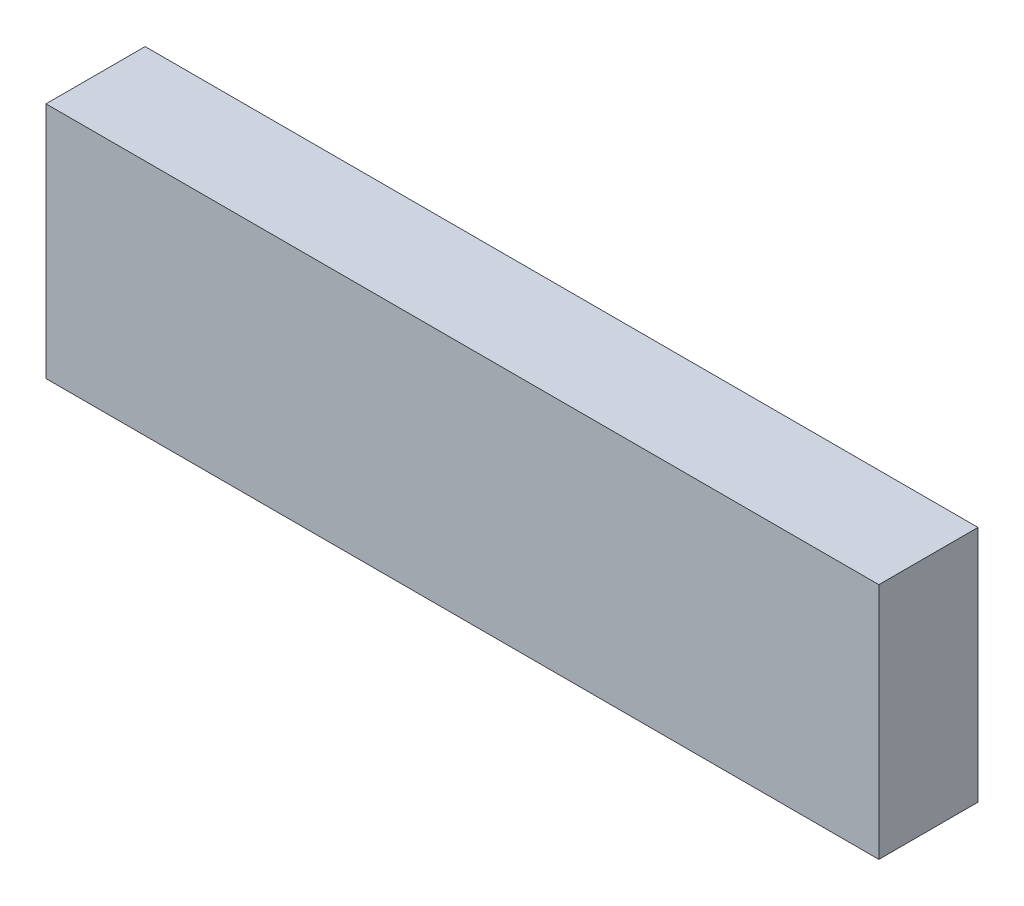
ISO-10303-21;
HEADER;
FILE_DESCRIPTION(('STEP AP214'),'2;1');
FILE_NAME('part.step','',(''),(''),'','','');
FILE_SCHEMA(('AUTOMOTIVE_DESIGN { 1 0 10303 214 1 1 1 1 }'));
ENDSEC;
DATA;
#1=APPLICATION_CONTEXT('core data for automotive mechanical design processes');
#2=APPLICATION_PROTOCOL_DEFINITION('international standard','automotive_design',2000,#1);
#3=PRODUCT_CONTEXT('',#1,'mechanical');
#4=PRODUCT('Part','Part','',(#3));
#5=PRODUCT_RELATED_PRODUCT_CATEGORY('part','',(#4));
#6=PRODUCT_DEFINITION_FORMATION('','',#4);
#7=PRODUCT_DEFINITION_CONTEXT('part definition',#1,'design');
#8=PRODUCT_DEFINITION('design','',#6,#7);
#9=PRODUCT_DEFINITION_SHAPE('','',#8);
#10=(LENGTH_UNIT() NAMED_UNIT(*) SI_UNIT(.MILLI.,.METRE.));
#11=(NAMED_UNIT(*) PLANE_ANGLE_UNIT() SI_UNIT($,.RADIAN.));
#12=(NAMED_UNIT(*) SI_UNIT($,.STERADIAN.) SOLID_ANGLE_UNIT());
#13=UNCERTAINTY_MEASURE_WITH_UNIT(LENGTH_MEASURE(1.E-05),#10,'distance_accuracy_value','');
#14=(GEOMETRIC_REPRESENTATION_CONTEXT(3) GLOBAL_UNCERTAINTY_ASSIGNED_CONTEXT((#13)) GLOBAL_UNIT_ASSIGNED_CONTEXT((#10,
#11,#12)) REPRESENTATION_CONTEXT('',''));
#15=CARTESIAN_POINT('',(0.,0.,0.));
#16=DIRECTION('',(0.,0.,1.));
#17=DIRECTION('',(1.,0.,0.));
#18=AXIS2_PLACEMENT_3D('',#15,#16,#17);
#19=CARTESIAN_POINT('',(-10.5,3.,-1.25));
#20=DIRECTION('',(1.,0.,0.));
#21=DIRECTION('',(0.,0.,-1.));
#22=AXIS2_PLACEMENT_3D('',#19,#20,#21);
#23=PLANE('',#22);
#24=DIRECTION('',(0.,0.,1.));
#25=VECTOR('',#24,1.);
#26=CARTESIAN_POINT('',(-10.5,-3.,-1.25));
#27=LINE('',#26,#25);
#28=CARTESIAN_POINT('',(-10.5,-3.,-1.25));
#29=VERTEX_POINT('',#28);
#30=CARTESIAN_POINT('',(-10.5,-3.,1.25));
#31=VERTEX_POINT('',#30);
#32=EDGE_CURVE('E99',#29,#31,#27,.T.);
#33=ORIENTED_EDGE('',*,*,#32,.T.);
#34=DIRECTION('',(0.,-1.,0.));
#35=VECTOR('',#34,1.);
#36=CARTESIAN_POINT('',(-10.5,3.,1.25));
#37=LINE('',#36,#35);
#38=CARTESIAN_POINT('',(-10.5,3.,1.25));
#39=VERTEX_POINT('',#38);
#40=EDGE_CURVE('E11',#39,#31,#37,.T.);
#41=ORIENTED_EDGE('',*,*,#40,.F.);
#42=DIRECTION('',(0.,0.,1.));
#43=VECTOR('',#42,1.);
#44=CARTESIAN_POINT('',(-10.5,3.,-1.25));
#45=LINE('',#44,#43);
#46=CARTESIAN_POINT('',(-10.5,3.,-1.25));
#47=VERTEX_POINT('',#46);
#48=EDGE_CURVE('E87',#47,#39,#45,.T.);
#49=ORIENTED_EDGE('',*,*,#48,.F.);
#50=DIRECTION('',(0.,-1.,0.));
#51=VECTOR('',#50,1.);
#52=CARTESIAN_POINT('',(-10.5,3.,-1.25));
#53=LINE('',#52,#51);
#54=EDGE_CURVE('E95',#47,#29,#53,.T.);
#55=ORIENTED_EDGE('',*,*,#54,.T.);
#56=EDGE_LOOP('',(#33,#41,#49,#55));
#57=FACE_BOUND('',#56,.T.);
#58=ADVANCED_FACE('F36',(#57),#23,.F.);
#59=CARTESIAN_POINT('',(10.5,3.,1.25));
#60=DIRECTION('',(0.,0.,-1.));
#61=DIRECTION('',(-1.,0.,0.));
#62=AXIS2_PLACEMENT_3D('',#59,#60,#61);
#63=PLANE('',#62);
#64=DIRECTION('',(1.,0.,0.));
#65=VECTOR('',#64,1.);
#66=CARTESIAN_POINT('',(10.5,-3.,1.25));
#67=LINE('',#66,#65);
#68=CARTESIAN_POINT('',(10.5,-3.,1.25));
#69=VERTEX_POINT('',#68);
#70=EDGE_CURVE('E91',#31,#69,#67,.T.);
#71=ORIENTED_EDGE('',*,*,#70,.T.);
#72=DIRECTION('',(0.,-1.,0.));
#73=VECTOR('',#72,1.);
#74=CARTESIAN_POINT('',(10.5,3.,1.25));
#75=LINE('',#74,#73);
#76=CARTESIAN_POINT('',(10.5,3.,1.25));
#77=VERTEX_POINT('',#76);
#78=EDGE_CURVE('E44',#77,#69,#75,.T.);
#79=ORIENTED_EDGE('',*,*,#78,.F.);
#80=DIRECTION('',(1.,0.,0.));
#81=VECTOR('',#80,1.);
#82=CARTESIAN_POINT('',(10.5,3.,1.25));
#83=LINE('',#82,#81);
#84=EDGE_CURVE('E82',#39,#77,#83,.T.);
#85=ORIENTED_EDGE('',*,*,#84,.F.);
#86=ORIENTED_EDGE('',*,*,#40,.T.);
#87=EDGE_LOOP('',(#71,#79,#85,#86));
#88=FACE_BOUND('',#87,.T.);
#89=ADVANCED_FACE('F90',(#88),#63,.F.);
#90=CARTESIAN_POINT('',(10.5,3.,-1.25));
#91=DIRECTION('',(-1.,0.,0.));
#92=DIRECTION('',(0.,0.,1.));
#93=AXIS2_PLACEMENT_3D('',#90,#91,#92);
#94=PLANE('',#93);
#95=DIRECTION('',(0.,0.,-1.));
#96=VECTOR('',#95,1.);
#97=CARTESIAN_POINT('',(10.5,-3.,-1.25));
#98=LINE('',#97,#96);
#99=CARTESIAN_POINT('',(10.5,-3.,-1.25));
#100=VERTEX_POINT('',#99);
#101=EDGE_CURVE('E69',#69,#100,#98,.T.);
#102=ORIENTED_EDGE('',*,*,#101,.T.);
#103=DIRECTION('',(0.,-1.,0.));
#104=VECTOR('',#103,1.);
#105=CARTESIAN_POINT('',(10.5,3.,-1.25));
#106=LINE('',#105,#104);
#107=CARTESIAN_POINT('',(10.5,3.,-1.25));
#108=VERTEX_POINT('',#107);
#109=EDGE_CURVE('E92',#108,#100,#106,.T.);
#110=ORIENTED_EDGE('',*,*,#109,.F.);
#111=DIRECTION('',(0.,0.,-1.));
#112=VECTOR('',#111,1.);
#113=CARTESIAN_POINT('',(10.5,3.,-1.25));
#114=LINE('',#113,#112);
#115=EDGE_CURVE('E85',#77,#108,#114,.T.);
#116=ORIENTED_EDGE('',*,*,#115,.F.);
#117=ORIENTED_EDGE('',*,*,#78,.T.);
#118=EDGE_LOOP('',(#102,#110,#116,#117));
#119=FACE_BOUND('',#118,.T.);
#120=ADVANCED_FACE('F93',(#119),#94,.F.);
#121=CARTESIAN_POINT('',(10.5,3.,-1.25));
#122=DIRECTION('',(0.,0.,1.));
#123=DIRECTION('',(1.,0.,0.));
#124=AXIS2_PLACEMENT_3D('',#121,#122,#123);
#125=PLANE('',#124);
#126=DIRECTION('',(-1.,0.,0.));
#127=VECTOR('',#126,1.);
#128=CARTESIAN_POINT('',(10.5,-3.,-1.25));
#129=LINE('',#128,#127);
#130=EDGE_CURVE('E75',#100,#29,#129,.T.);
#131=ORIENTED_EDGE('',*,*,#130,.T.);
#132=ORIENTED_EDGE('',*,*,#54,.F.);
#133=DIRECTION('',(-1.,0.,0.));
#134=VECTOR('',#133,1.);
#135=CARTESIAN_POINT('',(10.5,3.,-1.25));
#136=LINE('',#135,#134);
#137=EDGE_CURVE('E52',#108,#47,#136,.T.);
#138=ORIENTED_EDGE('',*,*,#137,.F.);
#139=ORIENTED_EDGE('',*,*,#109,.T.);
#140=EDGE_LOOP('',(#131,#132,#138,#139));
#141=FACE_BOUND('',#140,.T.);
#142=ADVANCED_FACE('F106',(#141),#125,.F.);
#143=CARTESIAN_POINT('',(0.,3.,0.));
#144=DIRECTION('',(0.,-1.,0.));
#145=DIRECTION('',(0.,0.,-1.));
#146=AXIS2_PLACEMENT_3D('',#143,#144,#145);
#147=PLANE('',#146);
#148=ORIENTED_EDGE('',*,*,#48,.T.);
#149=ORIENTED_EDGE('',*,*,#84,.T.);
#150=ORIENTED_EDGE('',*,*,#115,.T.);
#151=ORIENTED_EDGE('',*,*,#137,.T.);
#152=EDGE_LOOP('',(#148,#149,#150,#151));
#153=FACE_BOUND('',#152,.T.);
#154=ADVANCED_FACE('F83',(#153),#147,.F.);
#155=CARTESIAN_POINT('',(0.,-3.,0.));
#156=DIRECTION('',(0.,-1.,0.));
#157=DIRECTION('',(0.,0.,-1.));
#158=AXIS2_PLACEMENT_3D('',#155,#156,#157);
#159=PLANE('',#158);
#160=ORIENTED_EDGE('',*,*,#32,.F.);
#161=ORIENTED_EDGE('',*,*,#130,.F.);
#162=ORIENTED_EDGE('',*,*,#101,.F.);
#163=ORIENTED_EDGE('',*,*,#70,.F.);
#164=EDGE_LOOP('',(#160,#161,#162,#163));
#165=FACE_BOUND('',#164,.T.);
#166=ADVANCED_FACE('F109',(#165),#159,.T.);
#167=CLOSED_SHELL('',(#58,#89,#120,#142,#154,#166));
#168=MANIFOLD_SOLID_BREP('B2',#167);
#169=ADVANCED_BREP_SHAPE_REPRESENTATION('',(#18,#168),#14);
#170=SHAPE_DEFINITION_REPRESENTATION(#9,#169);
ENDSEC;
END-ISO-10303-21;
